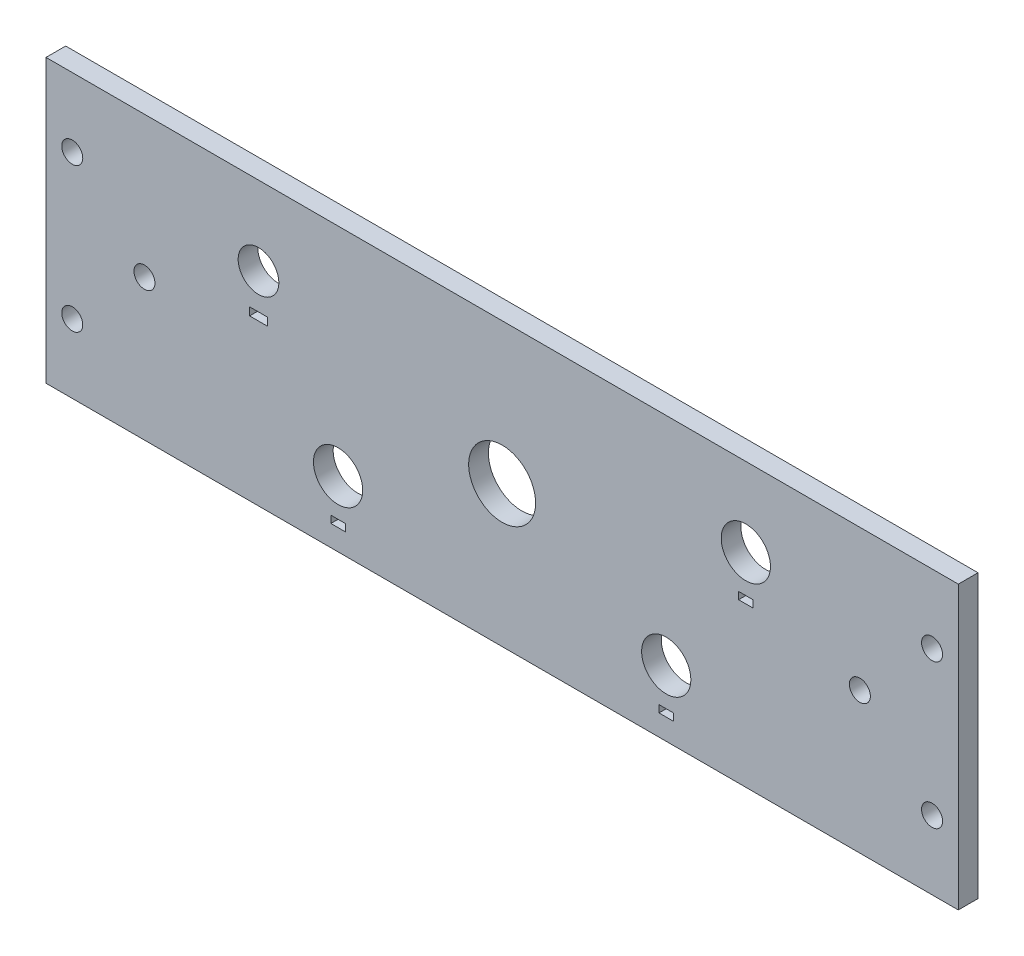
ISO-10303-21;
HEADER;
FILE_DESCRIPTION(('STEP AP214'),'2;1');
FILE_NAME('part.step','',(''),(''),'','','');
FILE_SCHEMA(('AUTOMOTIVE_DESIGN { 1 0 10303 214 1 1 1 1 }'));
ENDSEC;
DATA;
#1=APPLICATION_CONTEXT('core data for automotive mechanical design processes');
#2=APPLICATION_PROTOCOL_DEFINITION('international standard','automotive_design',2000,#1);
#3=PRODUCT_CONTEXT('',#1,'mechanical');
#4=PRODUCT('Part','Part','',(#3));
#5=PRODUCT_RELATED_PRODUCT_CATEGORY('part','',(#4));
#6=PRODUCT_DEFINITION_FORMATION('','',#4);
#7=PRODUCT_DEFINITION_CONTEXT('part definition',#1,'design');
#8=PRODUCT_DEFINITION('design','',#6,#7);
#9=PRODUCT_DEFINITION_SHAPE('','',#8);
#10=(LENGTH_UNIT() NAMED_UNIT(*) SI_UNIT(.MILLI.,.METRE.));
#11=(NAMED_UNIT(*) PLANE_ANGLE_UNIT() SI_UNIT($,.RADIAN.));
#12=(NAMED_UNIT(*) SI_UNIT($,.STERADIAN.) SOLID_ANGLE_UNIT());
#13=UNCERTAINTY_MEASURE_WITH_UNIT(LENGTH_MEASURE(1.E-05),#10,'distance_accuracy_value','');
#14=(GEOMETRIC_REPRESENTATION_CONTEXT(3) GLOBAL_UNCERTAINTY_ASSIGNED_CONTEXT((#13)) GLOBAL_UNIT_ASSIGNED_CONTEXT((#10,
#11,#12)) REPRESENTATION_CONTEXT('',''));
#15=CARTESIAN_POINT('',(0.,0.,0.));
#16=DIRECTION('',(0.,0.,1.));
#17=DIRECTION('',(1.,0.,0.));
#18=AXIS2_PLACEMENT_3D('',#15,#16,#17);
#19=CARTESIAN_POINT('',(0.,0.,3.));
#20=DIRECTION('',(0.,0.,-1.));
#21=DIRECTION('',(-1.,0.,0.));
#22=AXIS2_PLACEMENT_3D('',#19,#20,#21);
#23=PLANE('',#22);
#24=CARTESIAN_POINT('',(106.624355652982,31.,3.));
#25=DIRECTION('',(0.,0.,1.));
#26=DIRECTION('',(1.,0.,0.));
#27=AXIS2_PLACEMENT_3D('',#24,#25,#26);
#28=CIRCLE('',#27,3.74999999999995);
#29=CARTESIAN_POINT('',(110.374355652982,31.,3.));
#30=VERTEX_POINT('',#29);
#31=EDGE_CURVE('E216',#30,#30,#28,.T.);
#32=ORIENTED_EDGE('',*,*,#31,.F.);
#33=EDGE_LOOP('',(#32));
#34=FACE_BOUND('',#33,.T.);
#35=CARTESIAN_POINT('',(69.5,21.5,3.));
#36=DIRECTION('',(0.,0.,1.));
#37=DIRECTION('',(1.,0.,0.));
#38=AXIS2_PLACEMENT_3D('',#35,#36,#37);
#39=CIRCLE('',#38,5.1);
#40=CARTESIAN_POINT('',(74.6,21.5,3.));
#41=VERTEX_POINT('',#40);
#42=EDGE_CURVE('E225',#41,#41,#39,.T.);
#43=ORIENTED_EDGE('',*,*,#42,.F.);
#44=EDGE_LOOP('',(#43));
#45=FACE_BOUND('',#44,.T.);
#46=CARTESIAN_POINT('',(44.5,10.,3.));
#47=DIRECTION('',(0.,0.,1.));
#48=DIRECTION('',(-1.,0.,0.));
#49=AXIS2_PLACEMENT_3D('',#46,#47,#48);
#50=CIRCLE('',#49,3.75000000000001);
#51=CARTESIAN_POINT('',(40.75,10.,3.));
#52=VERTEX_POINT('',#51);
#53=EDGE_CURVE('E226',#52,#52,#50,.T.);
#54=ORIENTED_EDGE('',*,*,#53,.F.);
#55=EDGE_LOOP('',(#54));
#56=FACE_BOUND('',#55,.T.);
#57=DIRECTION('',(0.,1.,0.));
#58=VECTOR('',#57,1.);
#59=CARTESIAN_POINT('',(95.6,3.20000000000001,3.));
#60=LINE('',#59,#58);
#61=CARTESIAN_POINT('',(95.6,3.20000000000001,3.));
#62=VERTEX_POINT('',#61);
#63=CARTESIAN_POINT('',(95.6,4.30000000000001,3.));
#64=VERTEX_POINT('',#63);
#65=EDGE_CURVE('E234',#62,#64,#60,.T.);
#66=ORIENTED_EDGE('',*,*,#65,.F.);
#67=DIRECTION('',(1.,0.,0.));
#68=VECTOR('',#67,1.);
#69=CARTESIAN_POINT('',(93.4,3.20000000000001,3.));
#70=LINE('',#69,#68);
#71=CARTESIAN_POINT('',(93.4,3.20000000000001,3.));
#72=VERTEX_POINT('',#71);
#73=EDGE_CURVE('E245',#72,#62,#70,.T.);
#74=ORIENTED_EDGE('',*,*,#73,.F.);
#75=DIRECTION('',(0.,-1.,0.));
#76=VECTOR('',#75,1.);
#77=CARTESIAN_POINT('',(93.4,3.20000000000001,3.));
#78=LINE('',#77,#76);
#79=CARTESIAN_POINT('',(93.4,4.30000000000001,3.));
#80=VERTEX_POINT('',#79);
#81=EDGE_CURVE('E239',#80,#72,#78,.T.);
#82=ORIENTED_EDGE('',*,*,#81,.F.);
#83=DIRECTION('',(-1.,0.,0.));
#84=VECTOR('',#83,1.);
#85=CARTESIAN_POINT('',(93.4,4.30000000000001,3.));
#86=LINE('',#85,#84);
#87=EDGE_CURVE('E237',#64,#80,#86,.T.);
#88=ORIENTED_EDGE('',*,*,#87,.F.);
#89=EDGE_LOOP('',(#66,#74,#82,#88));
#90=FACE_BOUND('',#89,.T.);
#91=CARTESIAN_POINT('',(124.,21.5000000000004,3.));
#92=DIRECTION('',(0.,0.,1.));
#93=DIRECTION('',(1.,0.,0.));
#94=AXIS2_PLACEMENT_3D('',#91,#92,#93);
#95=CIRCLE('',#94,1.6);
#96=CARTESIAN_POINT('',(125.6,21.5000000000004,3.));
#97=VERTEX_POINT('',#96);
#98=EDGE_CURVE('E298',#97,#97,#95,.T.);
#99=ORIENTED_EDGE('',*,*,#98,.F.);
#100=EDGE_LOOP('',(#99));
#101=FACE_BOUND('',#100,.T.);
#102=CARTESIAN_POINT('',(15.,21.5000000000003,3.));
#103=DIRECTION('',(0.,0.,1.));
#104=DIRECTION('',(1.,0.,0.));
#105=AXIS2_PLACEMENT_3D('',#102,#103,#104);
#106=CIRCLE('',#105,1.6);
#107=CARTESIAN_POINT('',(16.6,21.5000000000003,3.));
#108=VERTEX_POINT('',#107);
#109=EDGE_CURVE('E305',#108,#108,#106,.T.);
#110=ORIENTED_EDGE('',*,*,#109,.F.);
#111=EDGE_LOOP('',(#110));
#112=FACE_BOUND('',#111,.T.);
#113=DIRECTION('',(1.,0.,0.));
#114=VECTOR('',#113,1.);
#115=CARTESIAN_POINT('',(45.6,3.2,3.));
#116=LINE('',#115,#114);
#117=CARTESIAN_POINT('',(43.4,3.2,3.));
#118=VERTEX_POINT('',#117);
#119=CARTESIAN_POINT('',(45.6,3.2,3.));
#120=VERTEX_POINT('',#119);
#121=EDGE_CURVE('E306',#118,#120,#116,.T.);
#122=ORIENTED_EDGE('',*,*,#121,.F.);
#123=DIRECTION('',(0.,-1.,0.));
#124=VECTOR('',#123,1.);
#125=CARTESIAN_POINT('',(43.4,3.2,3.));
#126=LINE('',#125,#124);
#127=CARTESIAN_POINT('',(43.4,4.3,3.));
#128=VERTEX_POINT('',#127);
#129=EDGE_CURVE('E316',#128,#118,#126,.T.);
#130=ORIENTED_EDGE('',*,*,#129,.F.);
#131=DIRECTION('',(-1.,0.,0.));
#132=VECTOR('',#131,1.);
#133=CARTESIAN_POINT('',(45.6,4.3,3.));
#134=LINE('',#133,#132);
#135=CARTESIAN_POINT('',(45.6,4.3,3.));
#136=VERTEX_POINT('',#135);
#137=EDGE_CURVE('E311',#136,#128,#134,.T.);
#138=ORIENTED_EDGE('',*,*,#137,.F.);
#139=DIRECTION('',(0.,1.,0.));
#140=VECTOR('',#139,1.);
#141=CARTESIAN_POINT('',(45.6,3.2,3.));
#142=LINE('',#141,#140);
#143=EDGE_CURVE('E309',#120,#136,#142,.T.);
#144=ORIENTED_EDGE('',*,*,#143,.F.);
#145=EDGE_LOOP('',(#122,#130,#138,#144));
#146=FACE_BOUND('',#145,.T.);
#147=DIRECTION('',(0.,-1.,0.));
#148=VECTOR('',#147,1.);
#149=CARTESIAN_POINT('',(0.,0.,3.));
#150=LINE('',#149,#148);
#151=CARTESIAN_POINT('',(0.,43.,3.));
#152=VERTEX_POINT('',#151);
#153=CARTESIAN_POINT('',(0.,0.,3.));
#154=VERTEX_POINT('',#153);
#155=EDGE_CURVE('E374',#152,#154,#150,.T.);
#156=ORIENTED_EDGE('',*,*,#155,.T.);
#157=DIRECTION('',(1.,0.,0.));
#158=VECTOR('',#157,1.);
#159=CARTESIAN_POINT('',(0.,0.,3.));
#160=LINE('',#159,#158);
#161=CARTESIAN_POINT('',(139.,0.,3.));
#162=VERTEX_POINT('',#161);
#163=EDGE_CURVE('E378',#154,#162,#160,.T.);
#164=ORIENTED_EDGE('',*,*,#163,.T.);
#165=DIRECTION('',(0.,1.,0.));
#166=VECTOR('',#165,1.);
#167=CARTESIAN_POINT('',(139.,0.,3.));
#168=LINE('',#167,#166);
#169=CARTESIAN_POINT('',(139.,43.,3.));
#170=VERTEX_POINT('',#169);
#171=EDGE_CURVE('E381',#162,#170,#168,.T.);
#172=ORIENTED_EDGE('',*,*,#171,.T.);
#173=DIRECTION('',(-1.,0.,0.));
#174=VECTOR('',#173,1.);
#175=CARTESIAN_POINT('',(0.,43.,3.));
#176=LINE('',#175,#174);
#177=EDGE_CURVE('E382',#170,#152,#176,.T.);
#178=ORIENTED_EDGE('',*,*,#177,.T.);
#179=EDGE_LOOP('',(#156,#164,#172,#178));
#180=FACE_BOUND('',#179,.T.);
#181=CARTESIAN_POINT('',(32.3756443470177,31.,3.));
#182=DIRECTION('',(0.,0.,1.));
#183=DIRECTION('',(1.,0.,0.));
#184=AXIS2_PLACEMENT_3D('',#181,#182,#183);
#185=CIRCLE('',#184,3.10000000000006);
#186=CARTESIAN_POINT('',(35.4756443470177,31.,3.));
#187=VERTEX_POINT('',#186);
#188=EDGE_CURVE('E369',#187,#187,#185,.T.);
#189=ORIENTED_EDGE('',*,*,#188,.F.);
#190=EDGE_LOOP('',(#189));
#191=FACE_BOUND('',#190,.T.);
#192=CARTESIAN_POINT('',(94.5,10.,3.));
#193=DIRECTION('',(0.,0.,1.));
#194=DIRECTION('',(1.,0.,0.));
#195=AXIS2_PLACEMENT_3D('',#192,#193,#194);
#196=CIRCLE('',#195,3.75000000000001);
#197=CARTESIAN_POINT('',(98.25,10.,3.));
#198=VERTEX_POINT('',#197);
#199=EDGE_CURVE('E361',#198,#198,#196,.T.);
#200=ORIENTED_EDGE('',*,*,#199,.F.);
#201=EDGE_LOOP('',(#200));
#202=FACE_BOUND('',#201,.T.);
#203=CARTESIAN_POINT('',(4.,32.5,3.));
#204=DIRECTION('',(0.,0.,1.));
#205=DIRECTION('',(1.,0.,0.));
#206=AXIS2_PLACEMENT_3D('',#203,#204,#205);
#207=CIRCLE('',#206,1.59999999999999);
#208=CARTESIAN_POINT('',(5.6,32.5,3.));
#209=VERTEX_POINT('',#208);
#210=EDGE_CURVE('E360',#209,#209,#207,.T.);
#211=ORIENTED_EDGE('',*,*,#210,.F.);
#212=EDGE_LOOP('',(#211));
#213=FACE_BOUND('',#212,.T.);
#214=CARTESIAN_POINT('',(135.,32.5,3.));
#215=DIRECTION('',(0.,0.,1.));
#216=DIRECTION('',(1.,0.,0.));
#217=AXIS2_PLACEMENT_3D('',#214,#215,#216);
#218=CIRCLE('',#217,1.59999999999999);
#219=CARTESIAN_POINT('',(136.6,32.5,3.));
#220=VERTEX_POINT('',#219);
#221=EDGE_CURVE('E353',#220,#220,#218,.T.);
#222=ORIENTED_EDGE('',*,*,#221,.F.);
#223=EDGE_LOOP('',(#222));
#224=FACE_BOUND('',#223,.T.);
#225=CARTESIAN_POINT('',(135.,10.5,3.));
#226=DIRECTION('',(0.,0.,1.));
#227=DIRECTION('',(1.,0.,0.));
#228=AXIS2_PLACEMENT_3D('',#225,#226,#227);
#229=CIRCLE('',#228,1.59999999999999);
#230=CARTESIAN_POINT('',(136.6,10.5,3.));
#231=VERTEX_POINT('',#230);
#232=EDGE_CURVE('E342',#231,#231,#229,.T.);
#233=ORIENTED_EDGE('',*,*,#232,.F.);
#234=EDGE_LOOP('',(#233));
#235=FACE_BOUND('',#234,.T.);
#236=CARTESIAN_POINT('',(4.,10.5,3.));
#237=DIRECTION('',(0.,0.,1.));
#238=DIRECTION('',(1.,0.,0.));
#239=AXIS2_PLACEMENT_3D('',#236,#237,#238);
#240=CIRCLE('',#239,1.6);
#241=CARTESIAN_POINT('',(5.6,10.5,3.));
#242=VERTEX_POINT('',#241);
#243=EDGE_CURVE('E337',#242,#242,#240,.T.);
#244=ORIENTED_EDGE('',*,*,#243,.F.);
#245=EDGE_LOOP('',(#244));
#246=FACE_BOUND('',#245,.T.);
#247=DIRECTION('',(0.,1.,0.));
#248=VECTOR('',#247,1.);
#249=CARTESIAN_POINT('',(33.7256443470177,24.4,3.));
#250=LINE('',#249,#248);
#251=CARTESIAN_POINT('',(33.7256443470177,24.4,3.));
#252=VERTEX_POINT('',#251);
#253=CARTESIAN_POINT('',(33.7256443470177,25.6,3.));
#254=VERTEX_POINT('',#253);
#255=EDGE_CURVE('E264',#252,#254,#250,.T.);
#256=ORIENTED_EDGE('',*,*,#255,.F.);
#257=DIRECTION('',(1.,0.,0.));
#258=VECTOR('',#257,1.);
#259=CARTESIAN_POINT('',(31.0256443470177,24.4,3.));
#260=LINE('',#259,#258);
#261=CARTESIAN_POINT('',(31.0256443470177,24.4,3.));
#262=VERTEX_POINT('',#261);
#263=EDGE_CURVE('E272',#262,#252,#260,.T.);
#264=ORIENTED_EDGE('',*,*,#263,.F.);
#265=DIRECTION('',(0.,-1.,0.));
#266=VECTOR('',#265,1.);
#267=CARTESIAN_POINT('',(31.0256443470177,24.4,3.));
#268=LINE('',#267,#266);
#269=CARTESIAN_POINT('',(31.0256443470177,25.6,3.));
#270=VERTEX_POINT('',#269);
#271=EDGE_CURVE('E269',#270,#262,#268,.T.);
#272=ORIENTED_EDGE('',*,*,#271,.F.);
#273=DIRECTION('',(-1.,0.,0.));
#274=VECTOR('',#273,1.);
#275=CARTESIAN_POINT('',(31.0256443470177,25.6,3.));
#276=LINE('',#275,#274);
#277=EDGE_CURVE('E270',#254,#270,#276,.T.);
#278=ORIENTED_EDGE('',*,*,#277,.F.);
#279=EDGE_LOOP('',(#256,#264,#272,#278));
#280=FACE_BOUND('',#279,.T.);
#281=DIRECTION('',(0.,1.,0.));
#282=VECTOR('',#281,1.);
#283=CARTESIAN_POINT('',(107.724355652982,24.2,3.));
#284=LINE('',#283,#282);
#285=CARTESIAN_POINT('',(107.724355652982,24.2,3.));
#286=VERTEX_POINT('',#285);
#287=CARTESIAN_POINT('',(107.724355652982,25.3,3.));
#288=VERTEX_POINT('',#287);
#289=EDGE_CURVE('E177',#286,#288,#284,.T.);
#290=ORIENTED_EDGE('',*,*,#289,.F.);
#291=DIRECTION('',(1.,0.,0.));
#292=VECTOR('',#291,1.);
#293=CARTESIAN_POINT('',(105.524355652982,24.2,3.));
#294=LINE('',#293,#292);
#295=CARTESIAN_POINT('',(105.524355652982,24.2,3.));
#296=VERTEX_POINT('',#295);
#297=EDGE_CURVE('E205',#296,#286,#294,.T.);
#298=ORIENTED_EDGE('',*,*,#297,.F.);
#299=DIRECTION('',(0.,-1.,0.));
#300=VECTOR('',#299,1.);
#301=CARTESIAN_POINT('',(105.524355652982,24.2,3.));
#302=LINE('',#301,#300);
#303=CARTESIAN_POINT('',(105.524355652982,25.3,3.));
#304=VERTEX_POINT('',#303);
#305=EDGE_CURVE('E199',#304,#296,#302,.T.);
#306=ORIENTED_EDGE('',*,*,#305,.F.);
#307=DIRECTION('',(-1.,0.,0.));
#308=VECTOR('',#307,1.);
#309=CARTESIAN_POINT('',(105.524355652982,25.3,3.));
#310=LINE('',#309,#308);
#311=EDGE_CURVE('E186',#288,#304,#310,.T.);
#312=ORIENTED_EDGE('',*,*,#311,.F.);
#313=EDGE_LOOP('',(#290,#298,#306,#312));
#314=FACE_BOUND('',#313,.T.);
#315=ADVANCED_FACE('F43',(#34,#45,#56,#90,#101,#112,#146,#180,#191,#202,#213,#224,#235,#246,
#280,#314),#23,.F.);
#316=CARTESIAN_POINT('',(0.,0.,0.));
#317=DIRECTION('',(0.,0.,-1.));
#318=DIRECTION('',(-1.,0.,0.));
#319=AXIS2_PLACEMENT_3D('',#316,#317,#318);
#320=PLANE('',#319);
#321=CARTESIAN_POINT('',(69.5,21.5,0.));
#322=DIRECTION('',(0.,0.,1.));
#323=DIRECTION('',(1.,0.,0.));
#324=AXIS2_PLACEMENT_3D('',#321,#322,#323);
#325=CIRCLE('',#324,5.1);
#326=CARTESIAN_POINT('',(74.6,21.5,0.));
#327=VERTEX_POINT('',#326);
#328=EDGE_CURVE('E218',#327,#327,#325,.T.);
#329=ORIENTED_EDGE('',*,*,#328,.T.);
#330=EDGE_LOOP('',(#329));
#331=FACE_BOUND('',#330,.T.);
#332=DIRECTION('',(1.,0.,0.));
#333=VECTOR('',#332,1.);
#334=CARTESIAN_POINT('',(93.4,3.20000000000001,0.));
#335=LINE('',#334,#333);
#336=CARTESIAN_POINT('',(93.4,3.20000000000001,0.));
#337=VERTEX_POINT('',#336);
#338=CARTESIAN_POINT('',(95.6,3.20000000000001,0.));
#339=VERTEX_POINT('',#338);
#340=EDGE_CURVE('E240',#337,#339,#335,.T.);
#341=ORIENTED_EDGE('',*,*,#340,.T.);
#342=DIRECTION('',(0.,1.,0.));
#343=VECTOR('',#342,1.);
#344=CARTESIAN_POINT('',(95.6,3.20000000000001,0.));
#345=LINE('',#344,#343);
#346=CARTESIAN_POINT('',(95.6,4.30000000000001,0.));
#347=VERTEX_POINT('',#346);
#348=EDGE_CURVE('E233',#339,#347,#345,.T.);
#349=ORIENTED_EDGE('',*,*,#348,.T.);
#350=DIRECTION('',(-1.,0.,0.));
#351=VECTOR('',#350,1.);
#352=CARTESIAN_POINT('',(93.4,4.30000000000001,0.));
#353=LINE('',#352,#351);
#354=CARTESIAN_POINT('',(93.4,4.30000000000001,0.));
#355=VERTEX_POINT('',#354);
#356=EDGE_CURVE('E250',#347,#355,#353,.T.);
#357=ORIENTED_EDGE('',*,*,#356,.T.);
#358=DIRECTION('',(0.,-1.,0.));
#359=VECTOR('',#358,1.);
#360=CARTESIAN_POINT('',(93.4,3.20000000000001,0.));
#361=LINE('',#360,#359);
#362=EDGE_CURVE('E247',#355,#337,#361,.T.);
#363=ORIENTED_EDGE('',*,*,#362,.T.);
#364=EDGE_LOOP('',(#341,#349,#357,#363));
#365=FACE_BOUND('',#364,.T.);
#366=DIRECTION('',(1.,0.,0.));
#367=VECTOR('',#366,1.);
#368=CARTESIAN_POINT('',(31.0256443470177,24.4,0.));
#369=LINE('',#368,#367);
#370=CARTESIAN_POINT('',(31.0256443470177,24.4,0.));
#371=VERTEX_POINT('',#370);
#372=CARTESIAN_POINT('',(33.7256443470177,24.4,0.));
#373=VERTEX_POINT('',#372);
#374=EDGE_CURVE('E268',#371,#373,#369,.T.);
#375=ORIENTED_EDGE('',*,*,#374,.T.);
#376=DIRECTION('',(0.,1.,0.));
#377=VECTOR('',#376,1.);
#378=CARTESIAN_POINT('',(33.7256443470177,24.4,0.));
#379=LINE('',#378,#377);
#380=CARTESIAN_POINT('',(33.7256443470177,25.6,0.));
#381=VERTEX_POINT('',#380);
#382=EDGE_CURVE('E262',#373,#381,#379,.T.);
#383=ORIENTED_EDGE('',*,*,#382,.T.);
#384=DIRECTION('',(-1.,0.,0.));
#385=VECTOR('',#384,1.);
#386=CARTESIAN_POINT('',(31.0256443470177,25.6,0.));
#387=LINE('',#386,#385);
#388=CARTESIAN_POINT('',(31.0256443470177,25.6,0.));
#389=VERTEX_POINT('',#388);
#390=EDGE_CURVE('E279',#381,#389,#387,.T.);
#391=ORIENTED_EDGE('',*,*,#390,.T.);
#392=DIRECTION('',(0.,-1.,0.));
#393=VECTOR('',#392,1.);
#394=CARTESIAN_POINT('',(31.0256443470177,24.4,0.));
#395=LINE('',#394,#393);
#396=EDGE_CURVE('E283',#389,#371,#395,.T.);
#397=ORIENTED_EDGE('',*,*,#396,.T.);
#398=EDGE_LOOP('',(#375,#383,#391,#397));
#399=FACE_BOUND('',#398,.T.);
#400=CARTESIAN_POINT('',(124.,21.5000000000004,0.));
#401=DIRECTION('',(0.,0.,1.));
#402=DIRECTION('',(1.,0.,0.));
#403=AXIS2_PLACEMENT_3D('',#400,#401,#402);
#404=CIRCLE('',#403,1.6);
#405=CARTESIAN_POINT('',(125.6,21.5000000000004,0.));
#406=VERTEX_POINT('',#405);
#407=EDGE_CURVE('E293',#406,#406,#404,.T.);
#408=ORIENTED_EDGE('',*,*,#407,.T.);
#409=EDGE_LOOP('',(#408));
#410=FACE_BOUND('',#409,.T.);
#411=DIRECTION('',(0.,-1.,0.));
#412=VECTOR('',#411,1.);
#413=CARTESIAN_POINT('',(43.4,3.2,0.));
#414=LINE('',#413,#412);
#415=CARTESIAN_POINT('',(43.4,4.3,0.));
#416=VERTEX_POINT('',#415);
#417=CARTESIAN_POINT('',(43.4,3.2,0.));
#418=VERTEX_POINT('',#417);
#419=EDGE_CURVE('E313',#416,#418,#414,.T.);
#420=ORIENTED_EDGE('',*,*,#419,.T.);
#421=DIRECTION('',(1.,0.,0.));
#422=VECTOR('',#421,1.);
#423=CARTESIAN_POINT('',(45.6,3.2,0.));
#424=LINE('',#423,#422);
#425=CARTESIAN_POINT('',(45.6,3.2,0.));
#426=VERTEX_POINT('',#425);
#427=EDGE_CURVE('E302',#418,#426,#424,.T.);
#428=ORIENTED_EDGE('',*,*,#427,.T.);
#429=DIRECTION('',(0.,1.,0.));
#430=VECTOR('',#429,1.);
#431=CARTESIAN_POINT('',(45.6,3.2,0.));
#432=LINE('',#431,#430);
#433=CARTESIAN_POINT('',(45.6,4.3,0.));
#434=VERTEX_POINT('',#433);
#435=EDGE_CURVE('E321',#426,#434,#432,.T.);
#436=ORIENTED_EDGE('',*,*,#435,.T.);
#437=DIRECTION('',(-1.,0.,0.));
#438=VECTOR('',#437,1.);
#439=CARTESIAN_POINT('',(45.6,4.3,0.));
#440=LINE('',#439,#438);
#441=EDGE_CURVE('E322',#434,#416,#440,.T.);
#442=ORIENTED_EDGE('',*,*,#441,.T.);
#443=EDGE_LOOP('',(#420,#428,#436,#442));
#444=FACE_BOUND('',#443,.T.);
#445=CARTESIAN_POINT('',(4.,10.5,0.));
#446=DIRECTION('',(0.,0.,1.));
#447=DIRECTION('',(1.,0.,0.));
#448=AXIS2_PLACEMENT_3D('',#445,#446,#447);
#449=CIRCLE('',#448,1.6);
#450=CARTESIAN_POINT('',(5.6,10.5,0.));
#451=VERTEX_POINT('',#450);
#452=EDGE_CURVE('E336',#451,#451,#449,.T.);
#453=ORIENTED_EDGE('',*,*,#452,.T.);
#454=EDGE_LOOP('',(#453));
#455=FACE_BOUND('',#454,.T.);
#456=CARTESIAN_POINT('',(135.,32.5,0.));
#457=DIRECTION('',(0.,0.,1.));
#458=DIRECTION('',(1.,0.,0.));
#459=AXIS2_PLACEMENT_3D('',#456,#457,#458);
#460=CIRCLE('',#459,1.59999999999999);
#461=CARTESIAN_POINT('',(136.6,32.5,0.));
#462=VERTEX_POINT('',#461);
#463=EDGE_CURVE('E346',#462,#462,#460,.T.);
#464=ORIENTED_EDGE('',*,*,#463,.T.);
#465=EDGE_LOOP('',(#464));
#466=FACE_BOUND('',#465,.T.);
#467=CARTESIAN_POINT('',(94.5,10.,0.));
#468=DIRECTION('',(0.,0.,1.));
#469=DIRECTION('',(1.,0.,0.));
#470=AXIS2_PLACEMENT_3D('',#467,#468,#469);
#471=CIRCLE('',#470,3.75000000000001);
#472=CARTESIAN_POINT('',(98.25,10.,0.));
#473=VERTEX_POINT('',#472);
#474=EDGE_CURVE('E357',#473,#473,#471,.T.);
#475=ORIENTED_EDGE('',*,*,#474,.T.);
#476=EDGE_LOOP('',(#475));
#477=FACE_BOUND('',#476,.T.);
#478=DIRECTION('',(0.,-1.,0.));
#479=VECTOR('',#478,1.);
#480=CARTESIAN_POINT('',(0.,0.,0.));
#481=LINE('',#480,#479);
#482=CARTESIAN_POINT('',(0.,43.,0.));
#483=VERTEX_POINT('',#482);
#484=CARTESIAN_POINT('',(0.,0.,0.));
#485=VERTEX_POINT('',#484);
#486=EDGE_CURVE('E375',#483,#485,#481,.T.);
#487=ORIENTED_EDGE('',*,*,#486,.F.);
#488=DIRECTION('',(-1.,0.,0.));
#489=VECTOR('',#488,1.);
#490=CARTESIAN_POINT('',(0.,43.,0.));
#491=LINE('',#490,#489);
#492=CARTESIAN_POINT('',(139.,43.,0.));
#493=VERTEX_POINT('',#492);
#494=EDGE_CURVE('E377',#493,#483,#491,.T.);
#495=ORIENTED_EDGE('',*,*,#494,.F.);
#496=DIRECTION('',(0.,1.,0.));
#497=VECTOR('',#496,1.);
#498=CARTESIAN_POINT('',(139.,0.,0.));
#499=LINE('',#498,#497);
#500=CARTESIAN_POINT('',(139.,0.,0.));
#501=VERTEX_POINT('',#500);
#502=EDGE_CURVE('E388',#501,#493,#499,.T.);
#503=ORIENTED_EDGE('',*,*,#502,.F.);
#504=DIRECTION('',(1.,0.,0.));
#505=VECTOR('',#504,1.);
#506=CARTESIAN_POINT('',(0.,0.,0.));
#507=LINE('',#506,#505);
#508=EDGE_CURVE('E389',#485,#501,#507,.T.);
#509=ORIENTED_EDGE('',*,*,#508,.F.);
#510=EDGE_LOOP('',(#487,#495,#503,#509));
#511=FACE_BOUND('',#510,.T.);
#512=CARTESIAN_POINT('',(32.3756443470177,31.,0.));
#513=DIRECTION('',(0.,0.,1.));
#514=DIRECTION('',(1.,0.,0.));
#515=AXIS2_PLACEMENT_3D('',#512,#513,#514);
#516=CIRCLE('',#515,3.10000000000006);
#517=CARTESIAN_POINT('',(35.4756443470177,31.,0.));
#518=VERTEX_POINT('',#517);
#519=EDGE_CURVE('E368',#518,#518,#516,.T.);
#520=ORIENTED_EDGE('',*,*,#519,.T.);
#521=EDGE_LOOP('',(#520));
#522=FACE_BOUND('',#521,.T.);
#523=CARTESIAN_POINT('',(4.,32.5,0.));
#524=DIRECTION('',(0.,0.,1.));
#525=DIRECTION('',(1.,0.,0.));
#526=AXIS2_PLACEMENT_3D('',#523,#524,#525);
#527=CIRCLE('',#526,1.59999999999999);
#528=CARTESIAN_POINT('',(5.6,32.5,0.));
#529=VERTEX_POINT('',#528);
#530=EDGE_CURVE('E352',#529,#529,#527,.T.);
#531=ORIENTED_EDGE('',*,*,#530,.T.);
#532=EDGE_LOOP('',(#531));
#533=FACE_BOUND('',#532,.T.);
#534=CARTESIAN_POINT('',(135.,10.5,0.));
#535=DIRECTION('',(0.,0.,1.));
#536=DIRECTION('',(1.,0.,0.));
#537=AXIS2_PLACEMENT_3D('',#534,#535,#536);
#538=CIRCLE('',#537,1.59999999999999);
#539=CARTESIAN_POINT('',(136.6,10.5,0.));
#540=VERTEX_POINT('',#539);
#541=EDGE_CURVE('E345',#540,#540,#538,.T.);
#542=ORIENTED_EDGE('',*,*,#541,.T.);
#543=EDGE_LOOP('',(#542));
#544=FACE_BOUND('',#543,.T.);
#545=CARTESIAN_POINT('',(15.,21.5000000000003,0.));
#546=DIRECTION('',(0.,0.,1.));
#547=DIRECTION('',(1.,0.,0.));
#548=AXIS2_PLACEMENT_3D('',#545,#546,#547);
#549=CIRCLE('',#548,1.6);
#550=CARTESIAN_POINT('',(16.6,21.5000000000003,0.));
#551=VERTEX_POINT('',#550);
#552=EDGE_CURVE('E297',#551,#551,#549,.T.);
#553=ORIENTED_EDGE('',*,*,#552,.T.);
#554=EDGE_LOOP('',(#553));
#555=FACE_BOUND('',#554,.T.);
#556=CARTESIAN_POINT('',(44.5,10.,0.));
#557=DIRECTION('',(0.,0.,1.));
#558=DIRECTION('',(-1.,0.,0.));
#559=AXIS2_PLACEMENT_3D('',#556,#557,#558);
#560=CIRCLE('',#559,3.75000000000001);
#561=CARTESIAN_POINT('',(40.75,10.,0.));
#562=VERTEX_POINT('',#561);
#563=EDGE_CURVE('E223',#562,#562,#560,.T.);
#564=ORIENTED_EDGE('',*,*,#563,.T.);
#565=EDGE_LOOP('',(#564));
#566=FACE_BOUND('',#565,.T.);
#567=CARTESIAN_POINT('',(106.624355652982,31.,0.));
#568=DIRECTION('',(0.,0.,1.));
#569=DIRECTION('',(1.,0.,0.));
#570=AXIS2_PLACEMENT_3D('',#567,#568,#569);
#571=CIRCLE('',#570,3.74999999999995);
#572=CARTESIAN_POINT('',(110.374355652982,31.,0.));
#573=VERTEX_POINT('',#572);
#574=EDGE_CURVE('E198',#573,#573,#571,.T.);
#575=ORIENTED_EDGE('',*,*,#574,.T.);
#576=EDGE_LOOP('',(#575));
#577=FACE_BOUND('',#576,.T.);
#578=DIRECTION('',(1.,0.,0.));
#579=VECTOR('',#578,1.);
#580=CARTESIAN_POINT('',(105.524355652982,24.2,0.));
#581=LINE('',#580,#579);
#582=CARTESIAN_POINT('',(105.524355652982,24.2,0.));
#583=VERTEX_POINT('',#582);
#584=CARTESIAN_POINT('',(107.724355652982,24.2,0.));
#585=VERTEX_POINT('',#584);
#586=EDGE_CURVE('E187',#583,#585,#581,.T.);
#587=ORIENTED_EDGE('',*,*,#586,.T.);
#588=DIRECTION('',(0.,1.,0.));
#589=VECTOR('',#588,1.);
#590=CARTESIAN_POINT('',(107.724355652982,24.2,0.));
#591=LINE('',#590,#589);
#592=CARTESIAN_POINT('',(107.724355652982,25.3,0.));
#593=VERTEX_POINT('',#592);
#594=EDGE_CURVE('E68',#585,#593,#591,.T.);
#595=ORIENTED_EDGE('',*,*,#594,.T.);
#596=DIRECTION('',(-1.,0.,0.));
#597=VECTOR('',#596,1.);
#598=CARTESIAN_POINT('',(105.524355652982,25.3,0.));
#599=LINE('',#598,#597);
#600=CARTESIAN_POINT('',(105.524355652982,25.3,0.));
#601=VERTEX_POINT('',#600);
#602=EDGE_CURVE('E192',#593,#601,#599,.T.);
#603=ORIENTED_EDGE('',*,*,#602,.T.);
#604=DIRECTION('',(0.,-1.,0.));
#605=VECTOR('',#604,1.);
#606=CARTESIAN_POINT('',(105.524355652982,24.2,0.));
#607=LINE('',#606,#605);
#608=EDGE_CURVE('E208',#601,#583,#607,.T.);
#609=ORIENTED_EDGE('',*,*,#608,.T.);
#610=EDGE_LOOP('',(#587,#595,#603,#609));
#611=FACE_BOUND('',#610,.T.);
#612=ADVANCED_FACE('F406',(#331,#365,#399,#410,#444,#455,#466,#477,#511,#522,#533,#544,#555,
#566,#577,#611),#320,.T.);
#613=CARTESIAN_POINT('',(0.,0.,3.));
#614=DIRECTION('',(1.,0.,0.));
#615=DIRECTION('',(0.,0.,-1.));
#616=AXIS2_PLACEMENT_3D('',#613,#614,#615);
#617=PLANE('',#616);
#618=ORIENTED_EDGE('',*,*,#486,.T.);
#619=DIRECTION('',(0.,0.,-1.));
#620=VECTOR('',#619,1.);
#621=CARTESIAN_POINT('',(0.,0.,3.));
#622=LINE('',#621,#620);
#623=EDGE_CURVE('E11',#154,#485,#622,.T.);
#624=ORIENTED_EDGE('',*,*,#623,.F.);
#625=ORIENTED_EDGE('',*,*,#155,.F.);
#626=DIRECTION('',(0.,0.,-1.));
#627=VECTOR('',#626,1.);
#628=CARTESIAN_POINT('',(0.,43.,3.));
#629=LINE('',#628,#627);
#630=EDGE_CURVE('E384',#152,#483,#629,.T.);
#631=ORIENTED_EDGE('',*,*,#630,.T.);
#632=EDGE_LOOP('',(#618,#624,#625,#631));
#633=FACE_BOUND('',#632,.T.);
#634=ADVANCED_FACE('F44',(#633),#617,.F.);
#635=CARTESIAN_POINT('',(0.,0.,3.));
#636=DIRECTION('',(0.,1.,0.));
#637=DIRECTION('',(0.,0.,1.));
#638=AXIS2_PLACEMENT_3D('',#635,#636,#637);
#639=PLANE('',#638);
#640=ORIENTED_EDGE('',*,*,#508,.T.);
#641=DIRECTION('',(0.,0.,-1.));
#642=VECTOR('',#641,1.);
#643=CARTESIAN_POINT('',(139.,0.,3.));
#644=LINE('',#643,#642);
#645=EDGE_CURVE('E51',#162,#501,#644,.T.);
#646=ORIENTED_EDGE('',*,*,#645,.F.);
#647=ORIENTED_EDGE('',*,*,#163,.F.);
#648=ORIENTED_EDGE('',*,*,#623,.T.);
#649=EDGE_LOOP('',(#640,#646,#647,#648));
#650=FACE_BOUND('',#649,.T.);
#651=ADVANCED_FACE('F420',(#650),#639,.F.);
#652=CARTESIAN_POINT('',(139.,0.,3.));
#653=DIRECTION('',(-1.,0.,0.));
#654=DIRECTION('',(0.,0.,1.));
#655=AXIS2_PLACEMENT_3D('',#652,#653,#654);
#656=PLANE('',#655);
#657=ORIENTED_EDGE('',*,*,#502,.T.);
#658=DIRECTION('',(0.,0.,-1.));
#659=VECTOR('',#658,1.);
#660=CARTESIAN_POINT('',(139.,43.,3.));
#661=LINE('',#660,#659);
#662=EDGE_CURVE('E394',#170,#493,#661,.T.);
#663=ORIENTED_EDGE('',*,*,#662,.F.);
#664=ORIENTED_EDGE('',*,*,#171,.F.);
#665=ORIENTED_EDGE('',*,*,#645,.T.);
#666=EDGE_LOOP('',(#657,#663,#664,#665));
#667=FACE_BOUND('',#666,.T.);
#668=ADVANCED_FACE('F405',(#667),#656,.F.);
#669=CARTESIAN_POINT('',(0.,43.,3.));
#670=DIRECTION('',(0.,-1.,0.));
#671=DIRECTION('',(1.,0.,0.));
#672=AXIS2_PLACEMENT_3D('',#669,#670,#671);
#673=PLANE('',#672);
#674=ORIENTED_EDGE('',*,*,#494,.T.);
#675=ORIENTED_EDGE('',*,*,#630,.F.);
#676=ORIENTED_EDGE('',*,*,#177,.F.);
#677=ORIENTED_EDGE('',*,*,#662,.T.);
#678=EDGE_LOOP('',(#674,#675,#676,#677));
#679=FACE_BOUND('',#678,.T.);
#680=ADVANCED_FACE('F415',(#679),#673,.F.);
#681=CARTESIAN_POINT('',(32.3756443470177,31.,3.));
#682=DIRECTION('',(0.,0.,-1.));
#683=DIRECTION('',(-1.,0.,0.));
#684=AXIS2_PLACEMENT_3D('',#681,#682,#683);
#685=CYLINDRICAL_SURFACE('',#684,3.10000000000006);
#686=ORIENTED_EDGE('',*,*,#188,.T.);
#687=EDGE_LOOP('',(#686));
#688=FACE_BOUND('',#687,.T.);
#689=ORIENTED_EDGE('',*,*,#519,.F.);
#690=EDGE_LOOP('',(#689));
#691=FACE_BOUND('',#690,.T.);
#692=ADVANCED_FACE('F440',(#688,#691),#685,.F.);
#693=CARTESIAN_POINT('',(94.5,10.,3.));
#694=DIRECTION('',(0.,0.,-1.));
#695=DIRECTION('',(-1.,0.,0.));
#696=AXIS2_PLACEMENT_3D('',#693,#694,#695);
#697=CYLINDRICAL_SURFACE('',#696,3.75000000000001);
#698=ORIENTED_EDGE('',*,*,#199,.T.);
#699=EDGE_LOOP('',(#698));
#700=FACE_BOUND('',#699,.T.);
#701=ORIENTED_EDGE('',*,*,#474,.F.);
#702=EDGE_LOOP('',(#701));
#703=FACE_BOUND('',#702,.T.);
#704=ADVANCED_FACE('F441',(#700,#703),#697,.F.);
#705=CARTESIAN_POINT('',(4.,32.5,3.));
#706=DIRECTION('',(0.,0.,-1.));
#707=DIRECTION('',(-1.,0.,0.));
#708=AXIS2_PLACEMENT_3D('',#705,#706,#707);
#709=CYLINDRICAL_SURFACE('',#708,1.59999999999999);
#710=ORIENTED_EDGE('',*,*,#210,.T.);
#711=EDGE_LOOP('',(#710));
#712=FACE_BOUND('',#711,.T.);
#713=ORIENTED_EDGE('',*,*,#530,.F.);
#714=EDGE_LOOP('',(#713));
#715=FACE_BOUND('',#714,.T.);
#716=ADVANCED_FACE('F447',(#712,#715),#709,.F.);
#717=CARTESIAN_POINT('',(135.,32.5,3.));
#718=DIRECTION('',(0.,0.,-1.));
#719=DIRECTION('',(-1.,0.,0.));
#720=AXIS2_PLACEMENT_3D('',#717,#718,#719);
#721=CYLINDRICAL_SURFACE('',#720,1.59999999999999);
#722=ORIENTED_EDGE('',*,*,#221,.T.);
#723=EDGE_LOOP('',(#722));
#724=FACE_BOUND('',#723,.T.);
#725=ORIENTED_EDGE('',*,*,#463,.F.);
#726=EDGE_LOOP('',(#725));
#727=FACE_BOUND('',#726,.T.);
#728=ADVANCED_FACE('F553',(#724,#727),#721,.F.);
#729=CARTESIAN_POINT('',(135.,10.5,3.));
#730=DIRECTION('',(0.,0.,-1.));
#731=DIRECTION('',(-1.,0.,0.));
#732=AXIS2_PLACEMENT_3D('',#729,#730,#731);
#733=CYLINDRICAL_SURFACE('',#732,1.59999999999999);
#734=ORIENTED_EDGE('',*,*,#232,.T.);
#735=EDGE_LOOP('',(#734));
#736=FACE_BOUND('',#735,.T.);
#737=ORIENTED_EDGE('',*,*,#541,.F.);
#738=EDGE_LOOP('',(#737));
#739=FACE_BOUND('',#738,.T.);
#740=ADVANCED_FACE('F552',(#736,#739),#733,.F.);
#741=CARTESIAN_POINT('',(4.,10.5,3.));
#742=DIRECTION('',(0.,0.,-1.));
#743=DIRECTION('',(-1.,0.,0.));
#744=AXIS2_PLACEMENT_3D('',#741,#742,#743);
#745=CYLINDRICAL_SURFACE('',#744,1.6);
#746=ORIENTED_EDGE('',*,*,#243,.T.);
#747=EDGE_LOOP('',(#746));
#748=FACE_BOUND('',#747,.T.);
#749=ORIENTED_EDGE('',*,*,#452,.F.);
#750=EDGE_LOOP('',(#749));
#751=FACE_BOUND('',#750,.T.);
#752=ADVANCED_FACE('F550',(#748,#751),#745,.F.);
#753=CARTESIAN_POINT('',(45.6,3.2,3.));
#754=DIRECTION('',(0.,1.,0.));
#755=DIRECTION('',(-1.,0.,0.));
#756=AXIS2_PLACEMENT_3D('',#753,#754,#755);
#757=PLANE('',#756);
#758=ORIENTED_EDGE('',*,*,#427,.F.);
#759=DIRECTION('',(0.,0.,-1.));
#760=VECTOR('',#759,1.);
#761=CARTESIAN_POINT('',(43.4,3.2,3.));
#762=LINE('',#761,#760);
#763=EDGE_CURVE('E318',#118,#418,#762,.T.);
#764=ORIENTED_EDGE('',*,*,#763,.F.);
#765=ORIENTED_EDGE('',*,*,#121,.T.);
#766=DIRECTION('',(0.,0.,-1.));
#767=VECTOR('',#766,1.);
#768=CARTESIAN_POINT('',(45.6,3.2,3.));
#769=LINE('',#768,#767);
#770=EDGE_CURVE('E333',#120,#426,#769,.T.);
#771=ORIENTED_EDGE('',*,*,#770,.T.);
#772=EDGE_LOOP('',(#758,#764,#765,#771));
#773=FACE_BOUND('',#772,.T.);
#774=ADVANCED_FACE('F543',(#773),#757,.T.);
#775=CARTESIAN_POINT('',(45.6,3.2,3.));
#776=DIRECTION('',(-1.,0.,0.));
#777=DIRECTION('',(0.,0.,1.));
#778=AXIS2_PLACEMENT_3D('',#775,#776,#777);
#779=PLANE('',#778);
#780=ORIENTED_EDGE('',*,*,#435,.F.);
#781=ORIENTED_EDGE('',*,*,#770,.F.);
#782=ORIENTED_EDGE('',*,*,#143,.T.);
#783=DIRECTION('',(0.,0.,-1.));
#784=VECTOR('',#783,1.);
#785=CARTESIAN_POINT('',(45.6,4.3,3.));
#786=LINE('',#785,#784);
#787=EDGE_CURVE('E334',#136,#434,#786,.T.);
#788=ORIENTED_EDGE('',*,*,#787,.T.);
#789=EDGE_LOOP('',(#780,#781,#782,#788));
#790=FACE_BOUND('',#789,.T.);
#791=ADVANCED_FACE('F537',(#790),#779,.T.);
#792=CARTESIAN_POINT('',(45.6,4.3,3.));
#793=DIRECTION('',(0.,-1.,0.));
#794=DIRECTION('',(0.,0.,-1.));
#795=AXIS2_PLACEMENT_3D('',#792,#793,#794);
#796=PLANE('',#795);
#797=ORIENTED_EDGE('',*,*,#441,.F.);
#798=ORIENTED_EDGE('',*,*,#787,.F.);
#799=ORIENTED_EDGE('',*,*,#137,.T.);
#800=DIRECTION('',(0.,0.,-1.));
#801=VECTOR('',#800,1.);
#802=CARTESIAN_POINT('',(43.4,4.3,3.));
#803=LINE('',#802,#801);
#804=EDGE_CURVE('E332',#128,#416,#803,.T.);
#805=ORIENTED_EDGE('',*,*,#804,.T.);
#806=EDGE_LOOP('',(#797,#798,#799,#805));
#807=FACE_BOUND('',#806,.T.);
#808=ADVANCED_FACE('F532',(#807),#796,.T.);
#809=CARTESIAN_POINT('',(43.4,3.2,3.));
#810=DIRECTION('',(1.,0.,0.));
#811=DIRECTION('',(0.,0.,-1.));
#812=AXIS2_PLACEMENT_3D('',#809,#810,#811);
#813=PLANE('',#812);
#814=ORIENTED_EDGE('',*,*,#419,.F.);
#815=ORIENTED_EDGE('',*,*,#804,.F.);
#816=ORIENTED_EDGE('',*,*,#129,.T.);
#817=ORIENTED_EDGE('',*,*,#763,.T.);
#818=EDGE_LOOP('',(#814,#815,#816,#817));
#819=FACE_BOUND('',#818,.T.);
#820=ADVANCED_FACE('F533',(#819),#813,.T.);
#821=CARTESIAN_POINT('',(15.,21.5000000000003,3.));
#822=DIRECTION('',(0.,0.,-1.));
#823=DIRECTION('',(-1.,0.,0.));
#824=AXIS2_PLACEMENT_3D('',#821,#822,#823);
#825=CYLINDRICAL_SURFACE('',#824,1.6);
#826=ORIENTED_EDGE('',*,*,#109,.T.);
#827=EDGE_LOOP('',(#826));
#828=FACE_BOUND('',#827,.T.);
#829=ORIENTED_EDGE('',*,*,#552,.F.);
#830=EDGE_LOOP('',(#829));
#831=FACE_BOUND('',#830,.T.);
#832=ADVANCED_FACE('F527',(#828,#831),#825,.F.);
#833=CARTESIAN_POINT('',(124.,21.5000000000004,3.));
#834=DIRECTION('',(0.,0.,-1.));
#835=DIRECTION('',(-1.,0.,0.));
#836=AXIS2_PLACEMENT_3D('',#833,#834,#835);
#837=CYLINDRICAL_SURFACE('',#836,1.6);
#838=ORIENTED_EDGE('',*,*,#98,.T.);
#839=EDGE_LOOP('',(#838));
#840=FACE_BOUND('',#839,.T.);
#841=ORIENTED_EDGE('',*,*,#407,.F.);
#842=EDGE_LOOP('',(#841));
#843=FACE_BOUND('',#842,.T.);
#844=ADVANCED_FACE('F521',(#840,#843),#837,.F.);
#845=CARTESIAN_POINT('',(33.7256443470177,24.4,3.));
#846=DIRECTION('',(-1.,0.,0.));
#847=DIRECTION('',(0.,0.,1.));
#848=AXIS2_PLACEMENT_3D('',#845,#846,#847);
#849=PLANE('',#848);
#850=ORIENTED_EDGE('',*,*,#382,.F.);
#851=DIRECTION('',(0.,0.,-1.));
#852=VECTOR('',#851,1.);
#853=CARTESIAN_POINT('',(33.7256443470177,24.4,3.));
#854=LINE('',#853,#852);
#855=EDGE_CURVE('E274',#252,#373,#854,.T.);
#856=ORIENTED_EDGE('',*,*,#855,.F.);
#857=ORIENTED_EDGE('',*,*,#255,.T.);
#858=DIRECTION('',(0.,0.,-1.));
#859=VECTOR('',#858,1.);
#860=CARTESIAN_POINT('',(33.7256443470177,25.6,3.));
#861=LINE('',#860,#859);
#862=EDGE_CURVE('E295',#254,#381,#861,.T.);
#863=ORIENTED_EDGE('',*,*,#862,.T.);
#864=EDGE_LOOP('',(#850,#856,#857,#863));
#865=FACE_BOUND('',#864,.T.);
#866=ADVANCED_FACE('F517',(#865),#849,.T.);
#867=CARTESIAN_POINT('',(31.0256443470177,25.6,3.));
#868=DIRECTION('',(0.,-1.,0.));
#869=DIRECTION('',(0.,0.,-1.));
#870=AXIS2_PLACEMENT_3D('',#867,#868,#869);
#871=PLANE('',#870);
#872=ORIENTED_EDGE('',*,*,#390,.F.);
#873=ORIENTED_EDGE('',*,*,#862,.F.);
#874=ORIENTED_EDGE('',*,*,#277,.T.);
#875=DIRECTION('',(0.,0.,-1.));
#876=VECTOR('',#875,1.);
#877=CARTESIAN_POINT('',(31.0256443470177,25.6,3.));
#878=LINE('',#877,#876);
#879=EDGE_CURVE('E287',#270,#389,#878,.T.);
#880=ORIENTED_EDGE('',*,*,#879,.T.);
#881=EDGE_LOOP('',(#872,#873,#874,#880));
#882=FACE_BOUND('',#881,.T.);
#883=ADVANCED_FACE('F513',(#882),#871,.T.);
#884=CARTESIAN_POINT('',(31.0256443470177,24.4,3.));
#885=DIRECTION('',(1.,0.,0.));
#886=DIRECTION('',(0.,0.,-1.));
#887=AXIS2_PLACEMENT_3D('',#884,#885,#886);
#888=PLANE('',#887);
#889=ORIENTED_EDGE('',*,*,#396,.F.);
#890=ORIENTED_EDGE('',*,*,#879,.F.);
#891=ORIENTED_EDGE('',*,*,#271,.T.);
#892=DIRECTION('',(0.,0.,-1.));
#893=VECTOR('',#892,1.);
#894=CARTESIAN_POINT('',(31.0256443470177,24.4,3.));
#895=LINE('',#894,#893);
#896=EDGE_CURVE('E286',#262,#371,#895,.T.);
#897=ORIENTED_EDGE('',*,*,#896,.T.);
#898=EDGE_LOOP('',(#889,#890,#891,#897));
#899=FACE_BOUND('',#898,.T.);
#900=ADVANCED_FACE('F512',(#899),#888,.T.);
#901=CARTESIAN_POINT('',(31.0256443470177,24.4,3.));
#902=DIRECTION('',(0.,1.,0.));
#903=DIRECTION('',(0.,0.,1.));
#904=AXIS2_PLACEMENT_3D('',#901,#902,#903);
#905=PLANE('',#904);
#906=ORIENTED_EDGE('',*,*,#374,.F.);
#907=ORIENTED_EDGE('',*,*,#896,.F.);
#908=ORIENTED_EDGE('',*,*,#263,.T.);
#909=ORIENTED_EDGE('',*,*,#855,.T.);
#910=EDGE_LOOP('',(#906,#907,#908,#909));
#911=FACE_BOUND('',#910,.T.);
#912=ADVANCED_FACE('F510',(#911),#905,.T.);
#913=CARTESIAN_POINT('',(95.6,3.20000000000001,3.));
#914=DIRECTION('',(-1.,0.,0.));
#915=DIRECTION('',(0.,0.,1.));
#916=AXIS2_PLACEMENT_3D('',#913,#914,#915);
#917=PLANE('',#916);
#918=ORIENTED_EDGE('',*,*,#348,.F.);
#919=DIRECTION('',(0.,0.,-1.));
#920=VECTOR('',#919,1.);
#921=CARTESIAN_POINT('',(95.6,3.20000000000001,3.));
#922=LINE('',#921,#920);
#923=EDGE_CURVE('E242',#62,#339,#922,.T.);
#924=ORIENTED_EDGE('',*,*,#923,.F.);
#925=ORIENTED_EDGE('',*,*,#65,.T.);
#926=DIRECTION('',(0.,0.,-1.));
#927=VECTOR('',#926,1.);
#928=CARTESIAN_POINT('',(95.6,4.30000000000001,3.));
#929=LINE('',#928,#927);
#930=EDGE_CURVE('E261',#64,#347,#929,.T.);
#931=ORIENTED_EDGE('',*,*,#930,.T.);
#932=EDGE_LOOP('',(#918,#924,#925,#931));
#933=FACE_BOUND('',#932,.T.);
#934=ADVANCED_FACE('F501',(#933),#917,.T.);
#935=CARTESIAN_POINT('',(93.4,4.30000000000001,3.));
#936=DIRECTION('',(0.,-1.,0.));
#937=DIRECTION('',(0.,0.,-1.));
#938=AXIS2_PLACEMENT_3D('',#935,#936,#937);
#939=PLANE('',#938);
#940=ORIENTED_EDGE('',*,*,#356,.F.);
#941=ORIENTED_EDGE('',*,*,#930,.F.);
#942=ORIENTED_EDGE('',*,*,#87,.T.);
#943=DIRECTION('',(0.,0.,-1.));
#944=VECTOR('',#943,1.);
#945=CARTESIAN_POINT('',(93.4,4.30000000000001,3.));
#946=LINE('',#945,#944);
#947=EDGE_CURVE('E259',#80,#355,#946,.T.);
#948=ORIENTED_EDGE('',*,*,#947,.T.);
#949=EDGE_LOOP('',(#940,#941,#942,#948));
#950=FACE_BOUND('',#949,.T.);
#951=ADVANCED_FACE('F496',(#950),#939,.T.);
#952=CARTESIAN_POINT('',(93.4,3.20000000000001,3.));
#953=DIRECTION('',(1.,0.,0.));
#954=DIRECTION('',(0.,0.,-1.));
#955=AXIS2_PLACEMENT_3D('',#952,#953,#954);
#956=PLANE('',#955);
#957=ORIENTED_EDGE('',*,*,#362,.F.);
#958=ORIENTED_EDGE('',*,*,#947,.F.);
#959=ORIENTED_EDGE('',*,*,#81,.T.);
#960=DIRECTION('',(0.,0.,-1.));
#961=VECTOR('',#960,1.);
#962=CARTESIAN_POINT('',(93.4,3.20000000000001,3.));
#963=LINE('',#962,#961);
#964=EDGE_CURVE('E260',#72,#337,#963,.T.);
#965=ORIENTED_EDGE('',*,*,#964,.T.);
#966=EDGE_LOOP('',(#957,#958,#959,#965));
#967=FACE_BOUND('',#966,.T.);
#968=ADVANCED_FACE('F494',(#967),#956,.T.);
#969=CARTESIAN_POINT('',(93.4,3.20000000000001,3.));
#970=DIRECTION('',(0.,1.,0.));
#971=DIRECTION('',(0.,0.,1.));
#972=AXIS2_PLACEMENT_3D('',#969,#970,#971);
#973=PLANE('',#972);
#974=ORIENTED_EDGE('',*,*,#340,.F.);
#975=ORIENTED_EDGE('',*,*,#964,.F.);
#976=ORIENTED_EDGE('',*,*,#73,.T.);
#977=ORIENTED_EDGE('',*,*,#923,.T.);
#978=EDGE_LOOP('',(#974,#975,#976,#977));
#979=FACE_BOUND('',#978,.T.);
#980=ADVANCED_FACE('F491',(#979),#973,.T.);
#981=CARTESIAN_POINT('',(44.5,10.,3.));
#982=DIRECTION('',(0.,0.,-1.));
#983=DIRECTION('',(-1.,0.,0.));
#984=AXIS2_PLACEMENT_3D('',#981,#982,#983);
#985=CYLINDRICAL_SURFACE('',#984,3.75000000000001);
#986=ORIENTED_EDGE('',*,*,#53,.T.);
#987=EDGE_LOOP('',(#986));
#988=FACE_BOUND('',#987,.T.);
#989=ORIENTED_EDGE('',*,*,#563,.F.);
#990=EDGE_LOOP('',(#989));
#991=FACE_BOUND('',#990,.T.);
#992=ADVANCED_FACE('F490',(#988,#991),#985,.F.);
#993=CARTESIAN_POINT('',(69.5,21.5,3.));
#994=DIRECTION('',(0.,0.,-1.));
#995=DIRECTION('',(-1.,0.,0.));
#996=AXIS2_PLACEMENT_3D('',#993,#994,#995);
#997=CYLINDRICAL_SURFACE('',#996,5.1);
#998=ORIENTED_EDGE('',*,*,#42,.T.);
#999=EDGE_LOOP('',(#998));
#1000=FACE_BOUND('',#999,.T.);
#1001=ORIENTED_EDGE('',*,*,#328,.F.);
#1002=EDGE_LOOP('',(#1001));
#1003=FACE_BOUND('',#1002,.T.);
#1004=ADVANCED_FACE('F483',(#1000,#1003),#997,.F.);
#1005=CARTESIAN_POINT('',(106.624355652982,31.,3.));
#1006=DIRECTION('',(0.,0.,-1.));
#1007=DIRECTION('',(-1.,0.,0.));
#1008=AXIS2_PLACEMENT_3D('',#1005,#1006,#1007);
#1009=CYLINDRICAL_SURFACE('',#1008,3.74999999999995);
#1010=ORIENTED_EDGE('',*,*,#31,.T.);
#1011=EDGE_LOOP('',(#1010));
#1012=FACE_BOUND('',#1011,.T.);
#1013=ORIENTED_EDGE('',*,*,#574,.F.);
#1014=EDGE_LOOP('',(#1013));
#1015=FACE_BOUND('',#1014,.T.);
#1016=ADVANCED_FACE('F477',(#1012,#1015),#1009,.F.);
#1017=CARTESIAN_POINT('',(107.724355652982,24.2,3.));
#1018=DIRECTION('',(-1.,0.,0.));
#1019=DIRECTION('',(0.,0.,1.));
#1020=AXIS2_PLACEMENT_3D('',#1017,#1018,#1019);
#1021=PLANE('',#1020);
#1022=ORIENTED_EDGE('',*,*,#594,.F.);
#1023=DIRECTION('',(0.,0.,-1.));
#1024=VECTOR('',#1023,1.);
#1025=CARTESIAN_POINT('',(107.724355652982,24.2,3.));
#1026=LINE('',#1025,#1024);
#1027=EDGE_CURVE('E184',#286,#585,#1026,.T.);
#1028=ORIENTED_EDGE('',*,*,#1027,.F.);
#1029=ORIENTED_EDGE('',*,*,#289,.T.);
#1030=DIRECTION('',(0.,0.,-1.));
#1031=VECTOR('',#1030,1.);
#1032=CARTESIAN_POINT('',(107.724355652982,25.3,3.));
#1033=LINE('',#1032,#1031);
#1034=EDGE_CURVE('E181',#288,#593,#1033,.T.);
#1035=ORIENTED_EDGE('',*,*,#1034,.T.);
#1036=EDGE_LOOP('',(#1022,#1028,#1029,#1035));
#1037=FACE_BOUND('',#1036,.T.);
#1038=ADVANCED_FACE('F185',(#1037),#1021,.T.);
#1039=CARTESIAN_POINT('',(105.524355652982,25.3,3.));
#1040=DIRECTION('',(0.,-1.,0.));
#1041=DIRECTION('',(0.,0.,-1.));
#1042=AXIS2_PLACEMENT_3D('',#1039,#1040,#1041);
#1043=PLANE('',#1042);
#1044=ORIENTED_EDGE('',*,*,#602,.F.);
#1045=ORIENTED_EDGE('',*,*,#1034,.F.);
#1046=ORIENTED_EDGE('',*,*,#311,.T.);
#1047=DIRECTION('',(0.,0.,-1.));
#1048=VECTOR('',#1047,1.);
#1049=CARTESIAN_POINT('',(105.524355652982,25.3,3.));
#1050=LINE('',#1049,#1048);
#1051=EDGE_CURVE('E197',#304,#601,#1050,.T.);
#1052=ORIENTED_EDGE('',*,*,#1051,.T.);
#1053=EDGE_LOOP('',(#1044,#1045,#1046,#1052));
#1054=FACE_BOUND('',#1053,.T.);
#1055=ADVANCED_FACE('F195',(#1054),#1043,.T.);
#1056=CARTESIAN_POINT('',(105.524355652982,24.2,3.));
#1057=DIRECTION('',(1.,0.,0.));
#1058=DIRECTION('',(0.,0.,-1.));
#1059=AXIS2_PLACEMENT_3D('',#1056,#1057,#1058);
#1060=PLANE('',#1059);
#1061=ORIENTED_EDGE('',*,*,#608,.F.);
#1062=ORIENTED_EDGE('',*,*,#1051,.F.);
#1063=ORIENTED_EDGE('',*,*,#305,.T.);
#1064=DIRECTION('',(0.,0.,-1.));
#1065=VECTOR('',#1064,1.);
#1066=CARTESIAN_POINT('',(105.524355652982,24.2,3.));
#1067=LINE('',#1066,#1065);
#1068=EDGE_CURVE('E59',#296,#583,#1067,.T.);
#1069=ORIENTED_EDGE('',*,*,#1068,.T.);
#1070=EDGE_LOOP('',(#1061,#1062,#1063,#1069));
#1071=FACE_BOUND('',#1070,.T.);
#1072=ADVANCED_FACE('F466',(#1071),#1060,.T.);
#1073=CARTESIAN_POINT('',(105.524355652982,24.2,3.));
#1074=DIRECTION('',(0.,1.,0.));
#1075=DIRECTION('',(0.,0.,1.));
#1076=AXIS2_PLACEMENT_3D('',#1073,#1074,#1075);
#1077=PLANE('',#1076);
#1078=ORIENTED_EDGE('',*,*,#586,.F.);
#1079=ORIENTED_EDGE('',*,*,#1068,.F.);
#1080=ORIENTED_EDGE('',*,*,#297,.T.);
#1081=ORIENTED_EDGE('',*,*,#1027,.T.);
#1082=EDGE_LOOP('',(#1078,#1079,#1080,#1081));
#1083=FACE_BOUND('',#1082,.T.);
#1084=ADVANCED_FACE('F468',(#1083),#1077,.T.);
#1085=CLOSED_SHELL('',(#315,#612,#634,#651,#668,#680,#692,#704,#716,#728,#740,#752,#774,#791,
#808,#820,#832,#844,#866,#883,#900,#912,#934,#951,#968,#980,#992,#1004,#1016,#1038,#1055,#1072,#1084));
#1086=MANIFOLD_SOLID_BREP('B2',#1085);
#1087=ADVANCED_BREP_SHAPE_REPRESENTATION('',(#18,#1086),#14);
#1088=SHAPE_DEFINITION_REPRESENTATION(#9,#1087);
ENDSEC;
END-ISO-10303-21;
